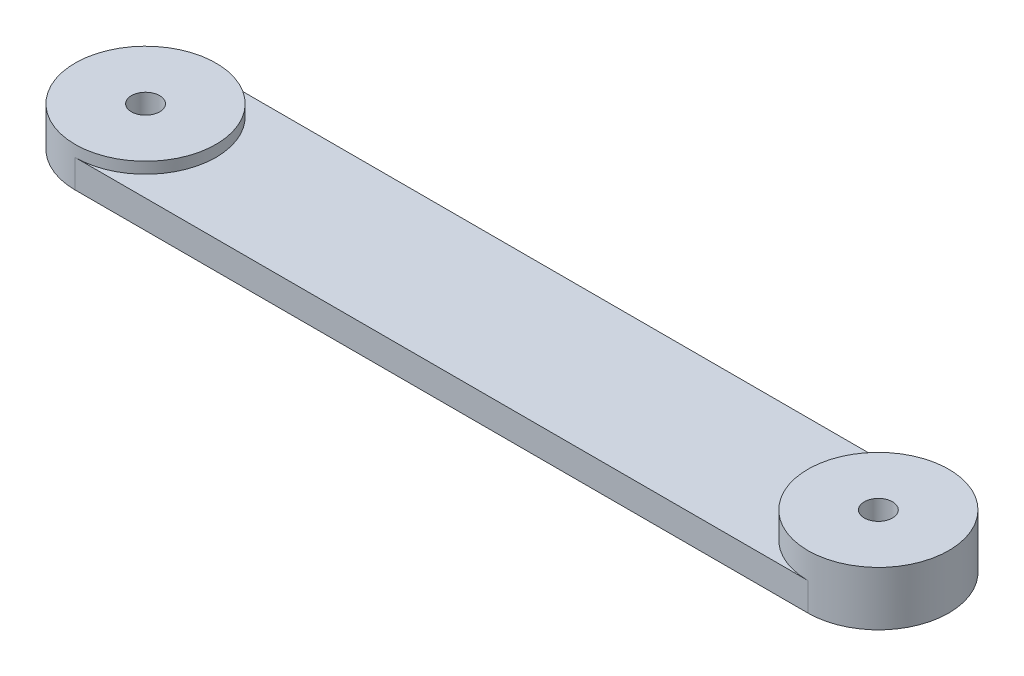
ISO-10303-21;
HEADER;
FILE_DESCRIPTION(('STEP AP214'),'2;1');
FILE_NAME('part.step','',(''),(''),'','','');
FILE_SCHEMA(('AUTOMOTIVE_DESIGN { 1 0 10303 214 1 1 1 1 }'));
ENDSEC;
DATA;
#1=APPLICATION_CONTEXT('core data for automotive mechanical design processes');
#2=APPLICATION_PROTOCOL_DEFINITION('international standard','automotive_design',2000,#1);
#3=PRODUCT_CONTEXT('',#1,'mechanical');
#4=PRODUCT('Part','Part','',(#3));
#5=PRODUCT_RELATED_PRODUCT_CATEGORY('part','',(#4));
#6=PRODUCT_DEFINITION_FORMATION('','',#4);
#7=PRODUCT_DEFINITION_CONTEXT('part definition',#1,'design');
#8=PRODUCT_DEFINITION('design','',#6,#7);
#9=PRODUCT_DEFINITION_SHAPE('','',#8);
#10=(LENGTH_UNIT() NAMED_UNIT(*) SI_UNIT(.MILLI.,.METRE.));
#11=(NAMED_UNIT(*) PLANE_ANGLE_UNIT() SI_UNIT($,.RADIAN.));
#12=(NAMED_UNIT(*) SI_UNIT($,.STERADIAN.) SOLID_ANGLE_UNIT());
#13=UNCERTAINTY_MEASURE_WITH_UNIT(LENGTH_MEASURE(1.E-05),#10,'distance_accuracy_value','');
#14=(GEOMETRIC_REPRESENTATION_CONTEXT(3) GLOBAL_UNCERTAINTY_ASSIGNED_CONTEXT((#13)) GLOBAL_UNIT_ASSIGNED_CONTEXT((#10,
#11,#12)) REPRESENTATION_CONTEXT('',''));
#15=CARTESIAN_POINT('',(0.,0.,0.));
#16=DIRECTION('',(0.,0.,1.));
#17=DIRECTION('',(1.,0.,0.));
#18=AXIS2_PLACEMENT_3D('',#15,#16,#17);
#19=CARTESIAN_POINT('',(-65.,5.,0.));
#20=DIRECTION('',(0.,1.,0.));
#21=DIRECTION('',(0.,0.,1.));
#22=AXIS2_PLACEMENT_3D('',#19,#20,#21);
#23=PLANE('',#22);
#24=DIRECTION('',(1.,0.,0.));
#25=VECTOR('',#24,1.);
#26=CARTESIAN_POINT('',(-65.,5.,12.5));
#27=LINE('',#26,#25);
#28=CARTESIAN_POINT('',(-65.,5.,12.5));
#29=VERTEX_POINT('',#28);
#30=CARTESIAN_POINT('',(65.,5.,12.5));
#31=VERTEX_POINT('',#30);
#32=EDGE_CURVE('E82',#29,#31,#27,.T.);
#33=ORIENTED_EDGE('',*,*,#32,.T.);
#34=CARTESIAN_POINT('',(65.,5.,0.));
#35=DIRECTION('',(0.,1.,0.));
#36=DIRECTION('',(0.,0.,1.));
#37=AXIS2_PLACEMENT_3D('',#34,#35,#36);
#38=CIRCLE('',#37,12.5);
#39=CARTESIAN_POINT('',(65.,5.,-12.5));
#40=VERTEX_POINT('',#39);
#41=EDGE_CURVE('E11',#31,#40,#38,.F.);
#42=ORIENTED_EDGE('',*,*,#41,.T.);
#43=DIRECTION('',(-1.,0.,0.));
#44=VECTOR('',#43,1.);
#45=CARTESIAN_POINT('',(-65.,5.,-12.5));
#46=LINE('',#45,#44);
#47=CARTESIAN_POINT('',(-65.,5.,-12.5));
#48=VERTEX_POINT('',#47);
#49=EDGE_CURVE('E51',#40,#48,#46,.T.);
#50=ORIENTED_EDGE('',*,*,#49,.T.);
#51=CARTESIAN_POINT('',(-65.,5.,0.));
#52=DIRECTION('',(0.,1.,0.));
#53=DIRECTION('',(0.,0.,1.));
#54=AXIS2_PLACEMENT_3D('',#51,#52,#53);
#55=CIRCLE('',#54,12.5);
#56=EDGE_CURVE('E89',#29,#48,#55,.T.);
#57=ORIENTED_EDGE('',*,*,#56,.F.);
#58=EDGE_LOOP('',(#33,#42,#50,#57));
#59=FACE_BOUND('',#58,.T.);
#60=ADVANCED_FACE('F35',(#59),#23,.T.);
#61=CARTESIAN_POINT('',(-65.,5.,0.));
#62=DIRECTION('',(0.,-1.,0.));
#63=DIRECTION('',(0.,0.,-1.));
#64=AXIS2_PLACEMENT_3D('',#61,#62,#63);
#65=CYLINDRICAL_SURFACE('',#64,12.5);
#66=CARTESIAN_POINT('',(-65.,0.,0.));
#67=DIRECTION('',(0.,1.,0.));
#68=DIRECTION('',(0.,0.,1.));
#69=AXIS2_PLACEMENT_3D('',#66,#67,#68);
#70=CIRCLE('',#69,12.5);
#71=CARTESIAN_POINT('',(-65.,0.,-12.5));
#72=VERTEX_POINT('',#71);
#73=CARTESIAN_POINT('',(-65.,0.,12.5));
#74=VERTEX_POINT('',#73);
#75=EDGE_CURVE('E88',#72,#74,#70,.T.);
#76=ORIENTED_EDGE('',*,*,#75,.T.);
#77=DIRECTION('',(0.,-1.,0.));
#78=VECTOR('',#77,1.);
#79=CARTESIAN_POINT('',(-65.,5.,12.5));
#80=LINE('',#79,#78);
#81=EDGE_CURVE('E44',#29,#74,#80,.T.);
#82=ORIENTED_EDGE('',*,*,#81,.F.);
#83=ORIENTED_EDGE('',*,*,#56,.T.);
#84=DIRECTION('',(0.,-1.,0.));
#85=VECTOR('',#84,1.);
#86=CARTESIAN_POINT('',(-65.,5.,-12.5));
#87=LINE('',#86,#85);
#88=EDGE_CURVE('E77',#48,#72,#87,.T.);
#89=ORIENTED_EDGE('',*,*,#88,.T.);
#90=EDGE_LOOP('',(#76,#82,#83,#89));
#91=FACE_BOUND('',#90,.T.);
#92=CARTESIAN_POINT('',(-65.,7.,0.));
#93=DIRECTION('',(0.,1.,0.));
#94=DIRECTION('',(0.,0.,1.));
#95=AXIS2_PLACEMENT_3D('',#92,#93,#94);
#96=CIRCLE('',#95,12.5);
#97=CARTESIAN_POINT('',(-65.,7.,12.5));
#98=VERTEX_POINT('',#97);
#99=EDGE_CURVE('E94',#98,#98,#96,.T.);
#100=ORIENTED_EDGE('',*,*,#99,.F.);
#101=EDGE_LOOP('',(#100));
#102=FACE_BOUND('',#101,.T.);
#103=ADVANCED_FACE('F37',(#91,#102),#65,.T.);
#104=CARTESIAN_POINT('',(-65.,5.,12.5));
#105=DIRECTION('',(0.,0.,-1.));
#106=DIRECTION('',(-1.,0.,0.));
#107=AXIS2_PLACEMENT_3D('',#104,#105,#106);
#108=PLANE('',#107);
#109=DIRECTION('',(1.,0.,0.));
#110=VECTOR('',#109,1.);
#111=CARTESIAN_POINT('',(-65.,0.,12.5));
#112=LINE('',#111,#110);
#113=CARTESIAN_POINT('',(65.,0.,12.5));
#114=VERTEX_POINT('',#113);
#115=EDGE_CURVE('E92',#74,#114,#112,.T.);
#116=ORIENTED_EDGE('',*,*,#115,.T.);
#117=DIRECTION('',(0.,-1.,0.));
#118=VECTOR('',#117,1.);
#119=CARTESIAN_POINT('',(65.,5.,12.5));
#120=LINE('',#119,#118);
#121=EDGE_CURVE('E104',#31,#114,#120,.T.);
#122=ORIENTED_EDGE('',*,*,#121,.F.);
#123=ORIENTED_EDGE('',*,*,#32,.F.);
#124=ORIENTED_EDGE('',*,*,#81,.T.);
#125=EDGE_LOOP('',(#116,#122,#123,#124));
#126=FACE_BOUND('',#125,.T.);
#127=ADVANCED_FACE('F107',(#126),#108,.F.);
#128=CARTESIAN_POINT('',(65.,5.,0.));
#129=DIRECTION('',(0.,-1.,0.));
#130=DIRECTION('',(0.,0.,-1.));
#131=AXIS2_PLACEMENT_3D('',#128,#129,#130);
#132=CYLINDRICAL_SURFACE('',#131,12.5);
#133=CARTESIAN_POINT('',(65.,0.,0.));
#134=DIRECTION('',(0.,1.,0.));
#135=DIRECTION('',(0.,0.,1.));
#136=AXIS2_PLACEMENT_3D('',#133,#134,#135);
#137=CIRCLE('',#136,12.5);
#138=CARTESIAN_POINT('',(65.,0.,-12.5));
#139=VERTEX_POINT('',#138);
#140=EDGE_CURVE('E69',#114,#139,#137,.T.);
#141=ORIENTED_EDGE('',*,*,#140,.T.);
#142=DIRECTION('',(0.,-1.,0.));
#143=VECTOR('',#142,1.);
#144=CARTESIAN_POINT('',(65.,5.,-12.5));
#145=LINE('',#144,#143);
#146=EDGE_CURVE('E79',#40,#139,#145,.T.);
#147=ORIENTED_EDGE('',*,*,#146,.F.);
#148=ORIENTED_EDGE('',*,*,#41,.F.);
#149=ORIENTED_EDGE('',*,*,#121,.T.);
#150=EDGE_LOOP('',(#141,#147,#148,#149));
#151=FACE_BOUND('',#150,.T.);
#152=CARTESIAN_POINT('',(65.,9.6,0.));
#153=DIRECTION('',(0.,1.,0.));
#154=DIRECTION('',(0.,0.,1.));
#155=AXIS2_PLACEMENT_3D('',#152,#153,#154);
#156=CIRCLE('',#155,12.5);
#157=CARTESIAN_POINT('',(65.,9.6,12.5));
#158=VERTEX_POINT('',#157);
#159=EDGE_CURVE('E122',#158,#158,#156,.T.);
#160=ORIENTED_EDGE('',*,*,#159,.F.);
#161=EDGE_LOOP('',(#160));
#162=FACE_BOUND('',#161,.T.);
#163=ADVANCED_FACE('F112',(#151,#162),#132,.T.);
#164=CARTESIAN_POINT('',(-65.,5.,-12.5));
#165=DIRECTION('',(0.,0.,1.));
#166=DIRECTION('',(1.,0.,0.));
#167=AXIS2_PLACEMENT_3D('',#164,#165,#166);
#168=PLANE('',#167);
#169=DIRECTION('',(-1.,0.,0.));
#170=VECTOR('',#169,1.);
#171=CARTESIAN_POINT('',(-65.,0.,-12.5));
#172=LINE('',#171,#170);
#173=EDGE_CURVE('E74',#139,#72,#172,.T.);
#174=ORIENTED_EDGE('',*,*,#173,.T.);
#175=ORIENTED_EDGE('',*,*,#88,.F.);
#176=ORIENTED_EDGE('',*,*,#49,.F.);
#177=ORIENTED_EDGE('',*,*,#146,.T.);
#178=EDGE_LOOP('',(#174,#175,#176,#177));
#179=FACE_BOUND('',#178,.T.);
#180=ADVANCED_FACE('F76',(#179),#168,.F.);
#181=CARTESIAN_POINT('',(-65.,0.,0.));
#182=DIRECTION('',(0.,1.,0.));
#183=DIRECTION('',(0.,0.,1.));
#184=AXIS2_PLACEMENT_3D('',#181,#182,#183);
#185=PLANE('',#184);
#186=CARTESIAN_POINT('',(65.,0.,0.));
#187=DIRECTION('',(0.,1.,0.));
#188=DIRECTION('',(0.,0.,1.));
#189=AXIS2_PLACEMENT_3D('',#186,#187,#188);
#190=CIRCLE('',#189,2.5);
#191=CARTESIAN_POINT('',(65.,0.,2.5));
#192=VERTEX_POINT('',#191);
#193=EDGE_CURVE('E125',#192,#192,#190,.F.);
#194=ORIENTED_EDGE('',*,*,#193,.F.);
#195=EDGE_LOOP('',(#194));
#196=FACE_BOUND('',#195,.T.);
#197=CARTESIAN_POINT('',(-65.,0.,0.));
#198=DIRECTION('',(0.,1.,0.));
#199=DIRECTION('',(0.,0.,1.));
#200=AXIS2_PLACEMENT_3D('',#197,#198,#199);
#201=CIRCLE('',#200,2.5);
#202=CARTESIAN_POINT('',(-65.,0.,2.5));
#203=VERTEX_POINT('',#202);
#204=EDGE_CURVE('E115',#203,#203,#201,.F.);
#205=ORIENTED_EDGE('',*,*,#204,.F.);
#206=EDGE_LOOP('',(#205));
#207=FACE_BOUND('',#206,.T.);
#208=ORIENTED_EDGE('',*,*,#75,.F.);
#209=ORIENTED_EDGE('',*,*,#173,.F.);
#210=ORIENTED_EDGE('',*,*,#140,.F.);
#211=ORIENTED_EDGE('',*,*,#115,.F.);
#212=EDGE_LOOP('',(#208,#209,#210,#211));
#213=FACE_BOUND('',#212,.T.);
#214=ADVANCED_FACE('F91',(#196,#207,#213),#185,.F.);
#215=CARTESIAN_POINT('',(-65.,7.,0.));
#216=DIRECTION('',(0.,1.,0.));
#217=DIRECTION('',(0.,0.,1.));
#218=AXIS2_PLACEMENT_3D('',#215,#216,#217);
#219=PLANE('',#218);
#220=CARTESIAN_POINT('',(-65.,7.,0.));
#221=DIRECTION('',(0.,1.,0.));
#222=DIRECTION('',(0.,0.,1.));
#223=AXIS2_PLACEMENT_3D('',#220,#221,#222);
#224=CIRCLE('',#223,2.5);
#225=CARTESIAN_POINT('',(-65.,7.,2.5));
#226=VERTEX_POINT('',#225);
#227=EDGE_CURVE('E119',#226,#226,#224,.T.);
#228=ORIENTED_EDGE('',*,*,#227,.F.);
#229=EDGE_LOOP('',(#228));
#230=FACE_BOUND('',#229,.T.);
#231=ORIENTED_EDGE('',*,*,#99,.T.);
#232=EDGE_LOOP('',(#231));
#233=FACE_BOUND('',#232,.T.);
#234=ADVANCED_FACE('F157',(#230,#233),#219,.T.);
#235=CARTESIAN_POINT('',(-65.,-0.00100000000000013,0.));
#236=DIRECTION('',(0.,1.,0.));
#237=DIRECTION('',(0.,0.,1.));
#238=AXIS2_PLACEMENT_3D('',#235,#236,#237);
#239=CYLINDRICAL_SURFACE('',#238,2.5);
#240=ORIENTED_EDGE('',*,*,#227,.T.);
#241=EDGE_LOOP('',(#240));
#242=FACE_BOUND('',#241,.T.);
#243=ORIENTED_EDGE('',*,*,#204,.T.);
#244=EDGE_LOOP('',(#243));
#245=FACE_BOUND('',#244,.T.);
#246=ADVANCED_FACE('F138',(#242,#245),#239,.F.);
#247=CARTESIAN_POINT('',(65.,9.6,0.));
#248=DIRECTION('',(0.,1.,0.));
#249=DIRECTION('',(0.,0.,1.));
#250=AXIS2_PLACEMENT_3D('',#247,#248,#249);
#251=PLANE('',#250);
#252=CARTESIAN_POINT('',(65.,9.6,0.));
#253=DIRECTION('',(0.,1.,0.));
#254=DIRECTION('',(0.,0.,1.));
#255=AXIS2_PLACEMENT_3D('',#252,#253,#254);
#256=CIRCLE('',#255,2.5);
#257=CARTESIAN_POINT('',(65.,9.6,2.5));
#258=VERTEX_POINT('',#257);
#259=EDGE_CURVE('E128',#258,#258,#256,.T.);
#260=ORIENTED_EDGE('',*,*,#259,.F.);
#261=EDGE_LOOP('',(#260));
#262=FACE_BOUND('',#261,.T.);
#263=ORIENTED_EDGE('',*,*,#159,.T.);
#264=EDGE_LOOP('',(#263));
#265=FACE_BOUND('',#264,.T.);
#266=ADVANCED_FACE('F135',(#262,#265),#251,.T.);
#267=CARTESIAN_POINT('',(65.,-0.000999999999999265,0.));
#268=DIRECTION('',(0.,1.,0.));
#269=DIRECTION('',(0.,0.,1.));
#270=AXIS2_PLACEMENT_3D('',#267,#268,#269);
#271=CYLINDRICAL_SURFACE('',#270,2.5);
#272=ORIENTED_EDGE('',*,*,#259,.T.);
#273=EDGE_LOOP('',(#272));
#274=FACE_BOUND('',#273,.T.);
#275=ORIENTED_EDGE('',*,*,#193,.T.);
#276=EDGE_LOOP('',(#275));
#277=FACE_BOUND('',#276,.T.);
#278=ADVANCED_FACE('F132',(#274,#277),#271,.F.);
#279=CLOSED_SHELL('',(#60,#103,#127,#163,#180,#214,#234,#246,#266,#278));
#280=MANIFOLD_SOLID_BREP('B2',#279);
#281=ADVANCED_BREP_SHAPE_REPRESENTATION('',(#18,#280),#14);
#282=SHAPE_DEFINITION_REPRESENTATION(#9,#281);
ENDSEC;
END-ISO-10303-21;
